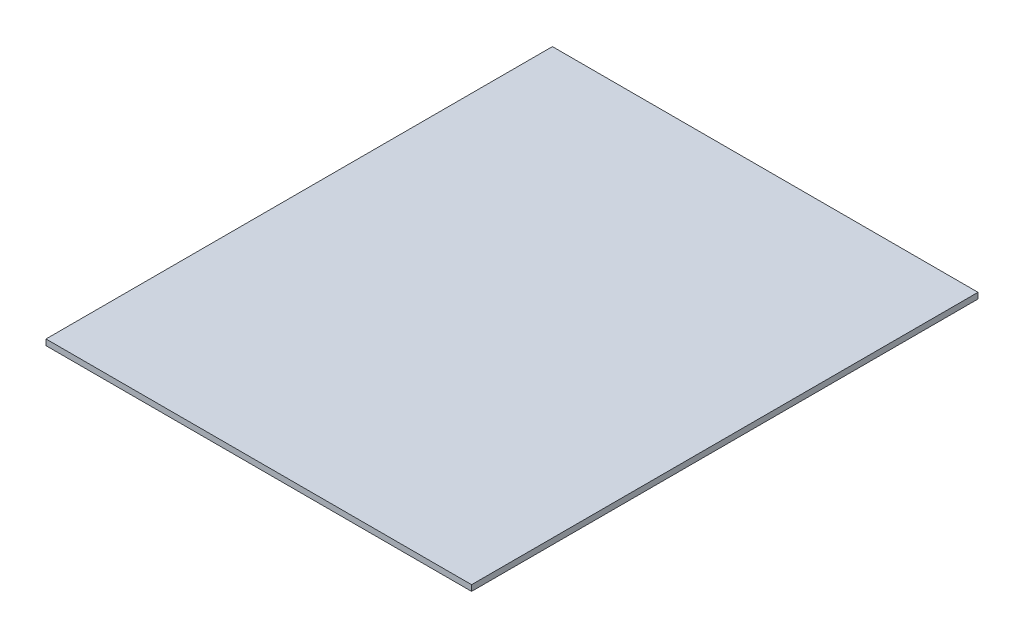
ISO-10303-21;
HEADER;
FILE_DESCRIPTION(('STEP AP214'),'2;1');
FILE_NAME('part.step','',(''),(''),'','','');
FILE_SCHEMA(('AUTOMOTIVE_DESIGN { 1 0 10303 214 1 1 1 1 }'));
ENDSEC;
DATA;
#1=APPLICATION_CONTEXT('core data for automotive mechanical design processes');
#2=APPLICATION_PROTOCOL_DEFINITION('international standard','automotive_design',2000,#1);
#3=PRODUCT_CONTEXT('',#1,'mechanical');
#4=PRODUCT('Part','Part','',(#3));
#5=PRODUCT_RELATED_PRODUCT_CATEGORY('part','',(#4));
#6=PRODUCT_DEFINITION_FORMATION('','',#4);
#7=PRODUCT_DEFINITION_CONTEXT('part definition',#1,'design');
#8=PRODUCT_DEFINITION('design','',#6,#7);
#9=PRODUCT_DEFINITION_SHAPE('','',#8);
#10=(LENGTH_UNIT() NAMED_UNIT(*) SI_UNIT(.MILLI.,.METRE.));
#11=(NAMED_UNIT(*) PLANE_ANGLE_UNIT() SI_UNIT($,.RADIAN.));
#12=(NAMED_UNIT(*) SI_UNIT($,.STERADIAN.) SOLID_ANGLE_UNIT());
#13=UNCERTAINTY_MEASURE_WITH_UNIT(LENGTH_MEASURE(1.E-05),#10,'distance_accuracy_value','');
#14=(GEOMETRIC_REPRESENTATION_CONTEXT(3) GLOBAL_UNCERTAINTY_ASSIGNED_CONTEXT((#13)) GLOBAL_UNIT_ASSIGNED_CONTEXT((#10,
#11,#12)) REPRESENTATION_CONTEXT('',''));
#15=CARTESIAN_POINT('',(0.,0.,0.));
#16=DIRECTION('',(0.,0.,1.));
#17=DIRECTION('',(1.,0.,0.));
#18=AXIS2_PLACEMENT_3D('',#15,#16,#17);
#19=CARTESIAN_POINT('',(109.25,3.,-130.));
#20=DIRECTION('',(-1.,0.,0.));
#21=DIRECTION('',(0.,0.,1.));
#22=AXIS2_PLACEMENT_3D('',#19,#20,#21);
#23=PLANE('',#22);
#24=DIRECTION('',(0.,0.,-1.));
#25=VECTOR('',#24,1.);
#26=CARTESIAN_POINT('',(109.25,0.,-130.));
#27=LINE('',#26,#25);
#28=CARTESIAN_POINT('',(109.25,0.,130.));
#29=VERTEX_POINT('',#28);
#30=CARTESIAN_POINT('',(109.25,0.,-130.));
#31=VERTEX_POINT('',#30);
#32=EDGE_CURVE('E96',#29,#31,#27,.T.);
#33=ORIENTED_EDGE('',*,*,#32,.T.);
#34=DIRECTION('',(0.,-1.,0.));
#35=VECTOR('',#34,1.);
#36=CARTESIAN_POINT('',(109.25,3.,-130.));
#37=LINE('',#36,#35);
#38=CARTESIAN_POINT('',(109.25,3.,-130.));
#39=VERTEX_POINT('',#38);
#40=EDGE_CURVE('E11',#39,#31,#37,.T.);
#41=ORIENTED_EDGE('',*,*,#40,.F.);
#42=DIRECTION('',(0.,0.,-1.));
#43=VECTOR('',#42,1.);
#44=CARTESIAN_POINT('',(109.25,3.,-130.));
#45=LINE('',#44,#43);
#46=CARTESIAN_POINT('',(109.25,3.,130.));
#47=VERTEX_POINT('',#46);
#48=EDGE_CURVE('E84',#47,#39,#45,.T.);
#49=ORIENTED_EDGE('',*,*,#48,.F.);
#50=DIRECTION('',(0.,-1.,0.));
#51=VECTOR('',#50,1.);
#52=CARTESIAN_POINT('',(109.25,3.,130.));
#53=LINE('',#52,#51);
#54=EDGE_CURVE('E92',#47,#29,#53,.T.);
#55=ORIENTED_EDGE('',*,*,#54,.T.);
#56=EDGE_LOOP('',(#33,#41,#49,#55));
#57=FACE_BOUND('',#56,.T.);
#58=ADVANCED_FACE('F33',(#57),#23,.F.);
#59=CARTESIAN_POINT('',(-109.25,3.,-130.));
#60=DIRECTION('',(0.,0.,1.));
#61=DIRECTION('',(1.,0.,0.));
#62=AXIS2_PLACEMENT_3D('',#59,#60,#61);
#63=PLANE('',#62);
#64=DIRECTION('',(-1.,0.,0.));
#65=VECTOR('',#64,1.);
#66=CARTESIAN_POINT('',(-109.25,0.,-130.));
#67=LINE('',#66,#65);
#68=CARTESIAN_POINT('',(-109.25,0.,-130.));
#69=VERTEX_POINT('',#68);
#70=EDGE_CURVE('E88',#31,#69,#67,.T.);
#71=ORIENTED_EDGE('',*,*,#70,.T.);
#72=DIRECTION('',(0.,-1.,0.));
#73=VECTOR('',#72,1.);
#74=CARTESIAN_POINT('',(-109.25,3.,-130.));
#75=LINE('',#74,#73);
#76=CARTESIAN_POINT('',(-109.25,3.,-130.));
#77=VERTEX_POINT('',#76);
#78=EDGE_CURVE('E41',#77,#69,#75,.T.);
#79=ORIENTED_EDGE('',*,*,#78,.F.);
#80=DIRECTION('',(-1.,0.,0.));
#81=VECTOR('',#80,1.);
#82=CARTESIAN_POINT('',(-109.25,3.,-130.));
#83=LINE('',#82,#81);
#84=EDGE_CURVE('E79',#39,#77,#83,.T.);
#85=ORIENTED_EDGE('',*,*,#84,.F.);
#86=ORIENTED_EDGE('',*,*,#40,.T.);
#87=EDGE_LOOP('',(#71,#79,#85,#86));
#88=FACE_BOUND('',#87,.T.);
#89=ADVANCED_FACE('F87',(#88),#63,.F.);
#90=CARTESIAN_POINT('',(-109.25,3.,-130.));
#91=DIRECTION('',(1.,0.,0.));
#92=DIRECTION('',(0.,0.,-1.));
#93=AXIS2_PLACEMENT_3D('',#90,#91,#92);
#94=PLANE('',#93);
#95=DIRECTION('',(0.,0.,1.));
#96=VECTOR('',#95,1.);
#97=CARTESIAN_POINT('',(-109.25,0.,-130.));
#98=LINE('',#97,#96);
#99=CARTESIAN_POINT('',(-109.25,0.,130.));
#100=VERTEX_POINT('',#99);
#101=EDGE_CURVE('E66',#69,#100,#98,.T.);
#102=ORIENTED_EDGE('',*,*,#101,.T.);
#103=DIRECTION('',(0.,-1.,0.));
#104=VECTOR('',#103,1.);
#105=CARTESIAN_POINT('',(-109.25,3.,130.));
#106=LINE('',#105,#104);
#107=CARTESIAN_POINT('',(-109.25,3.,130.));
#108=VERTEX_POINT('',#107);
#109=EDGE_CURVE('E89',#108,#100,#106,.T.);
#110=ORIENTED_EDGE('',*,*,#109,.F.);
#111=DIRECTION('',(0.,0.,1.));
#112=VECTOR('',#111,1.);
#113=CARTESIAN_POINT('',(-109.25,3.,-130.));
#114=LINE('',#113,#112);
#115=EDGE_CURVE('E82',#77,#108,#114,.T.);
#116=ORIENTED_EDGE('',*,*,#115,.F.);
#117=ORIENTED_EDGE('',*,*,#78,.T.);
#118=EDGE_LOOP('',(#102,#110,#116,#117));
#119=FACE_BOUND('',#118,.T.);
#120=ADVANCED_FACE('F90',(#119),#94,.F.);
#121=CARTESIAN_POINT('',(-109.25,3.,130.));
#122=DIRECTION('',(0.,0.,-1.));
#123=DIRECTION('',(-1.,0.,0.));
#124=AXIS2_PLACEMENT_3D('',#121,#122,#123);
#125=PLANE('',#124);
#126=DIRECTION('',(1.,0.,0.));
#127=VECTOR('',#126,1.);
#128=CARTESIAN_POINT('',(-109.25,0.,130.));
#129=LINE('',#128,#127);
#130=EDGE_CURVE('E72',#100,#29,#129,.T.);
#131=ORIENTED_EDGE('',*,*,#130,.T.);
#132=ORIENTED_EDGE('',*,*,#54,.F.);
#133=DIRECTION('',(1.,0.,0.));
#134=VECTOR('',#133,1.);
#135=CARTESIAN_POINT('',(-109.25,3.,130.));
#136=LINE('',#135,#134);
#137=EDGE_CURVE('E49',#108,#47,#136,.T.);
#138=ORIENTED_EDGE('',*,*,#137,.F.);
#139=ORIENTED_EDGE('',*,*,#109,.T.);
#140=EDGE_LOOP('',(#131,#132,#138,#139));
#141=FACE_BOUND('',#140,.T.);
#142=ADVANCED_FACE('F103',(#141),#125,.F.);
#143=CARTESIAN_POINT('',(0.,3.,0.));
#144=DIRECTION('',(0.,1.,0.));
#145=DIRECTION('',(0.,0.,1.));
#146=AXIS2_PLACEMENT_3D('',#143,#144,#145);
#147=PLANE('',#146);
#148=ORIENTED_EDGE('',*,*,#48,.T.);
#149=ORIENTED_EDGE('',*,*,#84,.T.);
#150=ORIENTED_EDGE('',*,*,#115,.T.);
#151=ORIENTED_EDGE('',*,*,#137,.T.);
#152=EDGE_LOOP('',(#148,#149,#150,#151));
#153=FACE_BOUND('',#152,.T.);
#154=ADVANCED_FACE('F80',(#153),#147,.T.);
#155=CARTESIAN_POINT('',(0.,0.,0.));
#156=DIRECTION('',(0.,1.,0.));
#157=DIRECTION('',(0.,0.,1.));
#158=AXIS2_PLACEMENT_3D('',#155,#156,#157);
#159=PLANE('',#158);
#160=ORIENTED_EDGE('',*,*,#32,.F.);
#161=ORIENTED_EDGE('',*,*,#130,.F.);
#162=ORIENTED_EDGE('',*,*,#101,.F.);
#163=ORIENTED_EDGE('',*,*,#70,.F.);
#164=EDGE_LOOP('',(#160,#161,#162,#163));
#165=FACE_BOUND('',#164,.T.);
#166=ADVANCED_FACE('F106',(#165),#159,.F.);
#167=CLOSED_SHELL('',(#58,#89,#120,#142,#154,#166));
#168=MANIFOLD_SOLID_BREP('B2',#167);
#169=ADVANCED_BREP_SHAPE_REPRESENTATION('',(#18,#168),#14);
#170=SHAPE_DEFINITION_REPRESENTATION(#9,#169);
ENDSEC;
END-ISO-10303-21;
